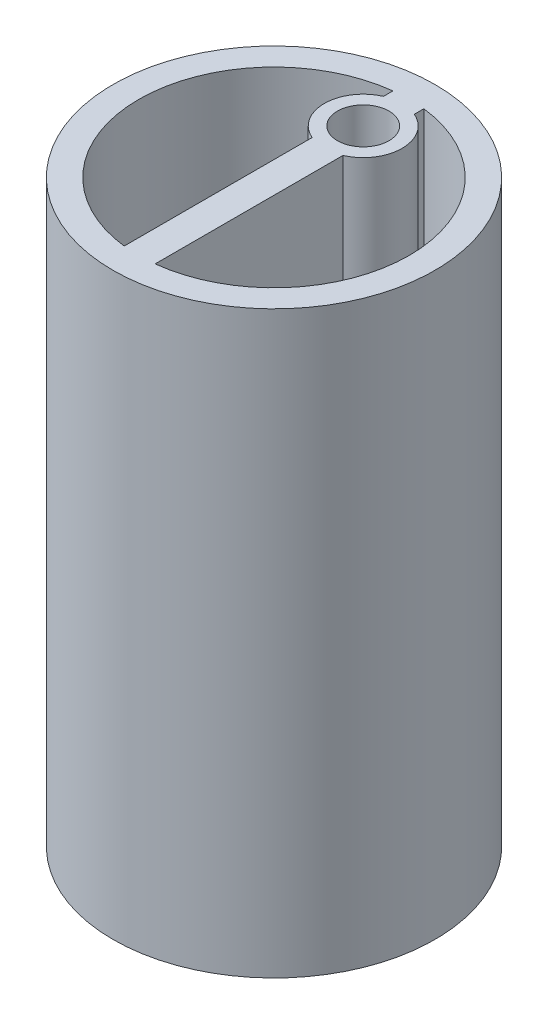
ISO-10303-21;
HEADER;
FILE_DESCRIPTION(('STEP AP214'),'2;1');
FILE_NAME('part.step','',(''),(''),'','','');
FILE_SCHEMA(('AUTOMOTIVE_DESIGN { 1 0 10303 214 1 1 1 1 }'));
ENDSEC;
DATA;
#1=APPLICATION_CONTEXT('core data for automotive mechanical design processes');
#2=APPLICATION_PROTOCOL_DEFINITION('international standard','automotive_design',2000,#1);
#3=PRODUCT_CONTEXT('',#1,'mechanical');
#4=PRODUCT('Part','Part','',(#3));
#5=PRODUCT_RELATED_PRODUCT_CATEGORY('part','',(#4));
#6=PRODUCT_DEFINITION_FORMATION('','',#4);
#7=PRODUCT_DEFINITION_CONTEXT('part definition',#1,'design');
#8=PRODUCT_DEFINITION('design','',#6,#7);
#9=PRODUCT_DEFINITION_SHAPE('','',#8);
#10=(LENGTH_UNIT() NAMED_UNIT(*) SI_UNIT(.MILLI.,.METRE.));
#11=(NAMED_UNIT(*) PLANE_ANGLE_UNIT() SI_UNIT($,.RADIAN.));
#12=(NAMED_UNIT(*) SI_UNIT($,.STERADIAN.) SOLID_ANGLE_UNIT());
#13=UNCERTAINTY_MEASURE_WITH_UNIT(LENGTH_MEASURE(1.E-05),#10,'distance_accuracy_value','');
#14=(GEOMETRIC_REPRESENTATION_CONTEXT(3) GLOBAL_UNCERTAINTY_ASSIGNED_CONTEXT((#13)) GLOBAL_UNIT_ASSIGNED_CONTEXT((#10,
#11,#12)) REPRESENTATION_CONTEXT('',''));
#15=CARTESIAN_POINT('',(0.,0.,0.));
#16=DIRECTION('',(0.,0.,1.));
#17=DIRECTION('',(1.,0.,0.));
#18=AXIS2_PLACEMENT_3D('',#15,#16,#17);
#19=CARTESIAN_POINT('',(-1.2,0.,-11.5945580988698));
#20=DIRECTION('',(-1.,0.,0.));
#21=DIRECTION('',(0.,0.,1.));
#22=AXIS2_PLACEMENT_3D('',#19,#20,#21);
#23=PLANE('',#22);
#24=DIRECTION('',(0.,1.,0.));
#25=VECTOR('',#24,1.);
#26=CARTESIAN_POINT('',(-1.2,0.,-4.15751707339592));
#27=LINE('',#26,#25);
#28=CARTESIAN_POINT('',(-1.2,0.,-4.15751707339592));
#29=VERTEX_POINT('',#28);
#30=CARTESIAN_POINT('',(-1.2,45.,-4.15751707339592));
#31=VERTEX_POINT('',#30);
#32=EDGE_CURVE('E185',#29,#31,#27,.T.);
#33=ORIENTED_EDGE('',*,*,#32,.F.);
#34=DIRECTION('',(0.,0.,1.));
#35=VECTOR('',#34,1.);
#36=CARTESIAN_POINT('',(-1.2,0.,-11.5945580988698));
#37=LINE('',#36,#35);
#38=CARTESIAN_POINT('',(-1.2,0.,10.4312031904282));
#39=VERTEX_POINT('',#38);
#40=EDGE_CURVE('E126',#29,#39,#37,.T.);
#41=ORIENTED_EDGE('',*,*,#40,.T.);
#42=DIRECTION('',(0.,-1.,0.));
#43=VECTOR('',#42,1.);
#44=CARTESIAN_POINT('',(-1.2,45.,10.4312031904282));
#45=LINE('',#44,#43);
#46=CARTESIAN_POINT('',(-1.2,45.,10.4312031904282));
#47=VERTEX_POINT('',#46);
#48=EDGE_CURVE('E160',#39,#47,#45,.F.);
#49=ORIENTED_EDGE('',*,*,#48,.T.);
#50=DIRECTION('',(0.,0.,1.));
#51=VECTOR('',#50,1.);
#52=CARTESIAN_POINT('',(-1.2,45.,-11.5945580988698));
#53=LINE('',#52,#51);
#54=EDGE_CURVE('E195',#31,#47,#53,.T.);
#55=ORIENTED_EDGE('',*,*,#54,.F.);
#56=EDGE_LOOP('',(#33,#41,#49,#55));
#57=FACE_BOUND('',#56,.T.);
#58=ADVANCED_FACE('F39',(#57),#23,.T.);
#59=CARTESIAN_POINT('',(1.2,0.,-11.5945580988698));
#60=DIRECTION('',(1.,0.,0.));
#61=DIRECTION('',(0.,0.,-1.));
#62=AXIS2_PLACEMENT_3D('',#59,#60,#61);
#63=PLANE('',#62);
#64=DIRECTION('',(0.,1.,0.));
#65=VECTOR('',#64,1.);
#66=CARTESIAN_POINT('',(1.2,0.,-9.6993938252536));
#67=LINE('',#66,#65);
#68=CARTESIAN_POINT('',(1.2,0.,-9.6993938252536));
#69=VERTEX_POINT('',#68);
#70=CARTESIAN_POINT('',(1.2,45.,-9.6993938252536));
#71=VERTEX_POINT('',#70);
#72=EDGE_CURVE('E11',#69,#71,#67,.T.);
#73=ORIENTED_EDGE('',*,*,#72,.F.);
#74=DIRECTION('',(0.,0.,-1.));
#75=VECTOR('',#74,1.);
#76=CARTESIAN_POINT('',(1.2,0.,-11.5945580988698));
#77=LINE('',#76,#75);
#78=CARTESIAN_POINT('',(1.2,0.,-10.4312031904282));
#79=VERTEX_POINT('',#78);
#80=EDGE_CURVE('E182',#69,#79,#77,.T.);
#81=ORIENTED_EDGE('',*,*,#80,.T.);
#82=DIRECTION('',(0.,-1.,0.));
#83=VECTOR('',#82,1.);
#84=CARTESIAN_POINT('',(1.2,45.,-10.4312031904282));
#85=LINE('',#84,#83);
#86=CARTESIAN_POINT('',(1.2,45.,-10.4312031904282));
#87=VERTEX_POINT('',#86);
#88=EDGE_CURVE('E150',#79,#87,#85,.F.);
#89=ORIENTED_EDGE('',*,*,#88,.T.);
#90=DIRECTION('',(0.,0.,-1.));
#91=VECTOR('',#90,1.);
#92=CARTESIAN_POINT('',(1.2,45.,-11.5945580988698));
#93=LINE('',#92,#91);
#94=EDGE_CURVE('E127',#71,#87,#93,.T.);
#95=ORIENTED_EDGE('',*,*,#94,.F.);
#96=EDGE_LOOP('',(#73,#81,#89,#95));
#97=FACE_BOUND('',#96,.T.);
#98=ADVANCED_FACE('F228',(#97),#63,.T.);
#99=CARTESIAN_POINT('',(0.,45.,0.));
#100=DIRECTION('',(0.,-1.,0.));
#101=DIRECTION('',(0.,0.,-1.));
#102=AXIS2_PLACEMENT_3D('',#99,#100,#101);
#103=CYLINDRICAL_SURFACE('',#102,10.5);
#104=DIRECTION('',(0.,-1.,0.));
#105=VECTOR('',#104,1.);
#106=CARTESIAN_POINT('',(-1.2,45.,-10.4312031904282));
#107=LINE('',#106,#105);
#108=CARTESIAN_POINT('',(-1.2,45.,-10.4312031904282));
#109=VERTEX_POINT('',#108);
#110=CARTESIAN_POINT('',(-1.2,0.,-10.4312031904282));
#111=VERTEX_POINT('',#110);
#112=EDGE_CURVE('E119',#109,#111,#107,.T.);
#113=ORIENTED_EDGE('',*,*,#112,.F.);
#114=CARTESIAN_POINT('',(0.,45.,0.));
#115=DIRECTION('',(0.,1.,0.));
#116=DIRECTION('',(0.,0.,1.));
#117=AXIS2_PLACEMENT_3D('',#114,#115,#116);
#118=CIRCLE('',#117,10.5);
#119=EDGE_CURVE('E140',#109,#47,#118,.T.);
#120=ORIENTED_EDGE('',*,*,#119,.T.);
#121=ORIENTED_EDGE('',*,*,#48,.F.);
#122=CARTESIAN_POINT('',(0.,0.,0.));
#123=DIRECTION('',(0.,1.,0.));
#124=DIRECTION('',(0.,0.,1.));
#125=AXIS2_PLACEMENT_3D('',#122,#123,#124);
#126=CIRCLE('',#125,10.5);
#127=EDGE_CURVE('E145',#111,#39,#126,.T.);
#128=ORIENTED_EDGE('',*,*,#127,.F.);
#129=EDGE_LOOP('',(#113,#120,#121,#128));
#130=FACE_BOUND('',#129,.T.);
#131=ADVANCED_FACE('F191',(#130),#103,.F.);
#132=CARTESIAN_POINT('',(0.,45.,0.));
#133=DIRECTION('',(0.,1.,0.));
#134=DIRECTION('',(0.,0.,1.));
#135=AXIS2_PLACEMENT_3D('',#132,#133,#134);
#136=PLANE('',#135);
#137=CARTESIAN_POINT('',(0.,45.,-6.92845544932476));
#138=DIRECTION('',(0.,1.,0.));
#139=DIRECTION('',(0.,0.,1.));
#140=AXIS2_PLACEMENT_3D('',#137,#138,#139);
#141=CIRCLE('',#140,2.);
#142=CARTESIAN_POINT('',(0.,45.,-4.92845544932476));
#143=VERTEX_POINT('',#142);
#144=EDGE_CURVE('E205',#143,#143,#141,.T.);
#145=ORIENTED_EDGE('',*,*,#144,.F.);
#146=EDGE_LOOP('',(#145));
#147=FACE_BOUND('',#146,.T.);
#148=CARTESIAN_POINT('',(-1.2,45.,-9.6993938252536));
#149=VERTEX_POINT('',#148);
#150=EDGE_CURVE('E133',#109,#149,#53,.T.);
#151=ORIENTED_EDGE('',*,*,#150,.T.);
#152=CARTESIAN_POINT('',(0.,45.,-6.92845544932476));
#153=DIRECTION('',(0.,1.,0.));
#154=DIRECTION('',(0.,0.,1.));
#155=AXIS2_PLACEMENT_3D('',#152,#153,#154);
#156=CIRCLE('',#155,3.01961909571309);
#157=EDGE_CURVE('E55',#149,#31,#156,.T.);
#158=ORIENTED_EDGE('',*,*,#157,.T.);
#159=ORIENTED_EDGE('',*,*,#54,.T.);
#160=ORIENTED_EDGE('',*,*,#119,.F.);
#161=EDGE_LOOP('',(#151,#158,#159,#160));
#162=FACE_BOUND('',#161,.T.);
#163=CARTESIAN_POINT('',(1.2,45.,-4.15751707339592));
#164=VERTEX_POINT('',#163);
#165=EDGE_CURVE('E63',#164,#71,#156,.T.);
#166=ORIENTED_EDGE('',*,*,#165,.T.);
#167=ORIENTED_EDGE('',*,*,#94,.T.);
#168=CARTESIAN_POINT('',(1.2,45.,10.4312031904282));
#169=VERTEX_POINT('',#168);
#170=EDGE_CURVE('E123',#169,#87,#118,.T.);
#171=ORIENTED_EDGE('',*,*,#170,.F.);
#172=EDGE_CURVE('E115',#169,#164,#93,.T.);
#173=ORIENTED_EDGE('',*,*,#172,.T.);
#174=EDGE_LOOP('',(#166,#167,#171,#173));
#175=FACE_BOUND('',#174,.T.);
#176=CARTESIAN_POINT('',(0.,45.,0.));
#177=DIRECTION('',(0.,1.,0.));
#178=DIRECTION('',(0.,0.,1.));
#179=AXIS2_PLACEMENT_3D('',#176,#177,#178);
#180=CIRCLE('',#179,12.5);
#181=CARTESIAN_POINT('',(0.,45.,-12.5));
#182=VERTEX_POINT('',#181);
#183=EDGE_CURVE('E146',#182,#182,#180,.T.);
#184=ORIENTED_EDGE('',*,*,#183,.T.);
#185=EDGE_LOOP('',(#184));
#186=FACE_BOUND('',#185,.T.);
#187=ADVANCED_FACE('F120',(#147,#162,#175,#186),#136,.T.);
#188=CARTESIAN_POINT('',(0.,0.,0.));
#189=DIRECTION('',(0.,1.,0.));
#190=DIRECTION('',(0.,0.,1.));
#191=AXIS2_PLACEMENT_3D('',#188,#189,#190);
#192=PLANE('',#191);
#193=CARTESIAN_POINT('',(0.,0.,-6.92845544932476));
#194=DIRECTION('',(0.,1.,0.));
#195=DIRECTION('',(0.,0.,1.));
#196=AXIS2_PLACEMENT_3D('',#193,#194,#195);
#197=CIRCLE('',#196,2.);
#198=CARTESIAN_POINT('',(0.,0.,-4.92845544932476));
#199=VERTEX_POINT('',#198);
#200=EDGE_CURVE('E209',#199,#199,#197,.T.);
#201=ORIENTED_EDGE('',*,*,#200,.T.);
#202=EDGE_LOOP('',(#201));
#203=FACE_BOUND('',#202,.T.);
#204=CARTESIAN_POINT('',(0.,0.,-6.92845544932476));
#205=DIRECTION('',(0.,1.,0.));
#206=DIRECTION('',(0.,0.,1.));
#207=AXIS2_PLACEMENT_3D('',#204,#205,#206);
#208=CIRCLE('',#207,3.01961909571309);
#209=CARTESIAN_POINT('',(-1.2,0.,-9.6993938252536));
#210=VERTEX_POINT('',#209);
#211=EDGE_CURVE('E108',#210,#29,#208,.T.);
#212=ORIENTED_EDGE('',*,*,#211,.F.);
#213=EDGE_CURVE('E131',#111,#210,#37,.T.);
#214=ORIENTED_EDGE('',*,*,#213,.F.);
#215=ORIENTED_EDGE('',*,*,#127,.T.);
#216=ORIENTED_EDGE('',*,*,#40,.F.);
#217=EDGE_LOOP('',(#212,#214,#215,#216));
#218=FACE_BOUND('',#217,.T.);
#219=ORIENTED_EDGE('',*,*,#80,.F.);
#220=CARTESIAN_POINT('',(1.2,0.,-4.15751707339592));
#221=VERTEX_POINT('',#220);
#222=EDGE_CURVE('E201',#221,#69,#208,.T.);
#223=ORIENTED_EDGE('',*,*,#222,.F.);
#224=CARTESIAN_POINT('',(1.2,0.,10.4312031904282));
#225=VERTEX_POINT('',#224);
#226=EDGE_CURVE('E117',#225,#221,#77,.T.);
#227=ORIENTED_EDGE('',*,*,#226,.F.);
#228=EDGE_CURVE('E141',#225,#79,#126,.T.);
#229=ORIENTED_EDGE('',*,*,#228,.T.);
#230=EDGE_LOOP('',(#219,#223,#227,#229));
#231=FACE_BOUND('',#230,.T.);
#232=CARTESIAN_POINT('',(0.,0.,0.));
#233=DIRECTION('',(0.,1.,0.));
#234=DIRECTION('',(0.,0.,1.));
#235=AXIS2_PLACEMENT_3D('',#232,#233,#234);
#236=CIRCLE('',#235,12.5);
#237=CARTESIAN_POINT('',(0.,0.,-12.5));
#238=VERTEX_POINT('',#237);
#239=EDGE_CURVE('E139',#238,#238,#236,.T.);
#240=ORIENTED_EDGE('',*,*,#239,.F.);
#241=EDGE_LOOP('',(#240));
#242=FACE_BOUND('',#241,.T.);
#243=ADVANCED_FACE('F178',(#203,#218,#231,#242),#192,.F.);
#244=CARTESIAN_POINT('',(0.,45.,0.));
#245=DIRECTION('',(0.,-1.,0.));
#246=DIRECTION('',(0.,0.,-1.));
#247=AXIS2_PLACEMENT_3D('',#244,#245,#246);
#248=CYLINDRICAL_SURFACE('',#247,12.5);
#249=CARTESIAN_POINT('',(0.,45.,-12.5));
#250=CARTESIAN_POINT('',(0.,44.53125,-12.5));
#251=CARTESIAN_POINT('',(0.,44.0625,-12.5));
#252=CARTESIAN_POINT('',(0.,43.125,-12.5));
#253=CARTESIAN_POINT('',(0.,42.65625,-12.5));
#254=CARTESIAN_POINT('',(0.,41.71875,-12.5));
#255=CARTESIAN_POINT('',(0.,41.25,-12.5));
#256=CARTESIAN_POINT('',(0.,40.3125,-12.5));
#257=CARTESIAN_POINT('',(0.,39.84375,-12.5));
#258=CARTESIAN_POINT('',(0.,38.90625,-12.5));
#259=CARTESIAN_POINT('',(0.,38.4375,-12.5));
#260=CARTESIAN_POINT('',(0.,37.5,-12.5));
#261=CARTESIAN_POINT('',(0.,37.03125,-12.5));
#262=CARTESIAN_POINT('',(0.,36.09375,-12.5));
#263=CARTESIAN_POINT('',(0.,35.625,-12.5));
#264=CARTESIAN_POINT('',(0.,34.6875,-12.5));
#265=CARTESIAN_POINT('',(0.,34.21875,-12.5));
#266=CARTESIAN_POINT('',(0.,33.28125,-12.5));
#267=CARTESIAN_POINT('',(0.,32.8125,-12.5));
#268=CARTESIAN_POINT('',(0.,31.875,-12.5));
#269=CARTESIAN_POINT('',(0.,31.40625,-12.5));
#270=CARTESIAN_POINT('',(0.,30.46875,-12.5));
#271=CARTESIAN_POINT('',(0.,30.,-12.5));
#272=CARTESIAN_POINT('',(0.,29.0625,-12.5));
#273=CARTESIAN_POINT('',(0.,28.59375,-12.5));
#274=CARTESIAN_POINT('',(0.,27.65625,-12.5));
#275=CARTESIAN_POINT('',(0.,27.1875,-12.5));
#276=CARTESIAN_POINT('',(0.,26.25,-12.5));
#277=CARTESIAN_POINT('',(0.,25.78125,-12.5));
#278=CARTESIAN_POINT('',(0.,24.84375,-12.5));
#279=CARTESIAN_POINT('',(0.,24.375,-12.5));
#280=CARTESIAN_POINT('',(0.,23.4375,-12.5));
#281=CARTESIAN_POINT('',(0.,22.96875,-12.5));
#282=CARTESIAN_POINT('',(0.,22.03125,-12.5));
#283=CARTESIAN_POINT('',(0.,21.5625,-12.5));
#284=CARTESIAN_POINT('',(0.,20.625,-12.5));
#285=CARTESIAN_POINT('',(0.,20.15625,-12.5));
#286=CARTESIAN_POINT('',(0.,19.21875,-12.5));
#287=CARTESIAN_POINT('',(0.,18.75,-12.5));
#288=CARTESIAN_POINT('',(0.,17.8125,-12.5));
#289=CARTESIAN_POINT('',(0.,17.34375,-12.5));
#290=CARTESIAN_POINT('',(0.,16.40625,-12.5));
#291=CARTESIAN_POINT('',(0.,15.9375,-12.5));
#292=CARTESIAN_POINT('',(0.,15.,-12.5));
#293=CARTESIAN_POINT('',(0.,14.53125,-12.5));
#294=CARTESIAN_POINT('',(0.,13.59375,-12.5));
#295=CARTESIAN_POINT('',(0.,13.125,-12.5));
#296=CARTESIAN_POINT('',(0.,12.1875,-12.5));
#297=CARTESIAN_POINT('',(0.,11.71875,-12.5));
#298=CARTESIAN_POINT('',(0.,10.78125,-12.5));
#299=CARTESIAN_POINT('',(0.,10.3125,-12.5));
#300=CARTESIAN_POINT('',(0.,9.37499999999999,-12.5));
#301=CARTESIAN_POINT('',(0.,8.90624999999999,-12.5));
#302=CARTESIAN_POINT('',(0.,7.96874999999999,-12.5));
#303=CARTESIAN_POINT('',(0.,7.5,-12.5));
#304=CARTESIAN_POINT('',(0.,6.56249999999999,-12.5));
#305=CARTESIAN_POINT('',(0.,6.09374999999999,-12.5));
#306=CARTESIAN_POINT('',(0.,5.15624999999999,-12.5));
#307=CARTESIAN_POINT('',(0.,4.68749999999999,-12.5));
#308=CARTESIAN_POINT('',(0.,3.74999999999999,-12.5));
#309=CARTESIAN_POINT('',(0.,3.28124999999999,-12.5));
#310=CARTESIAN_POINT('',(0.,2.34374999999999,-12.5));
#311=CARTESIAN_POINT('',(0.,1.87499999999999,-12.5));
#312=CARTESIAN_POINT('',(0.,0.937499999999992,-12.5));
#313=CARTESIAN_POINT('',(0.,0.468749999999993,-12.5));
#314=CARTESIAN_POINT('',(0.,0.,-12.5));
#315=B_SPLINE_CURVE_WITH_KNOTS('',3,(#249,#250,#251,#252,#253,#254,#255,#256,#257,#258,#259,
#260,#261,#262,#263,#264,#265,#266,#267,#268,#269,#270,#271,#272,#273,#274,#275,#276,#277,#278,
#279,#280,#281,#282,#283,#284,#285,#286,#287,#288,#289,#290,#291,#292,#293,#294,#295,#296,#297,
#298,#299,#300,#301,#302,#303,#304,#305,#306,#307,#308,#309,#310,#311,#312,#313,#314),
.UNSPECIFIED.,.F.,.F.,(4,2,2,2,2,2,2,2,2,2,2,2,2,2,2,2,2,2,2,2,2,2,2,2,2,2,2,2,2,2,2,2,4),(0.,
1.40625,2.8125,4.21874999999999,5.625,7.03125,8.43749999999999,9.84375,11.25,12.65625,14.0625,
15.46875,16.875,18.28125,19.6875,21.09375,22.5,23.90625,25.3125,26.71875,28.125,29.53125,
30.9375,32.34375,33.75,35.15625,36.5625,37.96875,39.375,40.78125,42.1875,43.59375,45.),.UNSPECIFIED.);
#316=EDGE_CURVE('BSEAM41',#182,#238,#315,.T.);
#317=ORIENTED_EDGE('',*,*,#183,.F.);
#318=ORIENTED_EDGE('',*,*,#239,.T.);
#319=ORIENTED_EDGE('',*,*,#316,.T.);
#320=ORIENTED_EDGE('',*,*,#316,.F.);
#321=EDGE_LOOP('',(#317,#319,#318,#320));
#322=FACE_BOUND('',#321,.T.);
#323=ADVANCED_FACE('F41',(#322),#248,.T.);
#324=DIRECTION('',(0.,-1.,0.));
#325=VECTOR('',#324,1.);
#326=CARTESIAN_POINT('',(1.2,45.,10.4312031904282));
#327=LINE('',#326,#325);
#328=EDGE_CURVE('E157',#169,#225,#327,.T.);
#329=ORIENTED_EDGE('',*,*,#328,.F.);
#330=ORIENTED_EDGE('',*,*,#170,.T.);
#331=ORIENTED_EDGE('',*,*,#88,.F.);
#332=ORIENTED_EDGE('',*,*,#228,.F.);
#333=EDGE_LOOP('',(#329,#330,#331,#332));
#334=FACE_BOUND('',#333,.T.);
#335=ADVANCED_FACE('F236',(#334),#103,.F.);
#336=DIRECTION('',(0.,1.,0.));
#337=VECTOR('',#336,1.);
#338=CARTESIAN_POINT('',(-1.2,0.,-9.6993938252536));
#339=LINE('',#338,#337);
#340=EDGE_CURVE('E198',#149,#210,#339,.F.);
#341=ORIENTED_EDGE('',*,*,#340,.F.);
#342=ORIENTED_EDGE('',*,*,#150,.F.);
#343=ORIENTED_EDGE('',*,*,#112,.T.);
#344=ORIENTED_EDGE('',*,*,#213,.T.);
#345=EDGE_LOOP('',(#341,#342,#343,#344));
#346=FACE_BOUND('',#345,.T.);
#347=ADVANCED_FACE('F172',(#346),#23,.T.);
#348=DIRECTION('',(0.,1.,0.));
#349=VECTOR('',#348,1.);
#350=CARTESIAN_POINT('',(1.2,0.,-4.15751707339592));
#351=LINE('',#350,#349);
#352=EDGE_CURVE('E48',#164,#221,#351,.F.);
#353=ORIENTED_EDGE('',*,*,#352,.F.);
#354=ORIENTED_EDGE('',*,*,#172,.F.);
#355=ORIENTED_EDGE('',*,*,#328,.T.);
#356=ORIENTED_EDGE('',*,*,#226,.T.);
#357=EDGE_LOOP('',(#353,#354,#355,#356));
#358=FACE_BOUND('',#357,.T.);
#359=ADVANCED_FACE('F113',(#358),#63,.T.);
#360=CARTESIAN_POINT('',(0.,0.,-6.92845544932476));
#361=DIRECTION('',(0.,1.,0.));
#362=DIRECTION('',(0.,0.,1.));
#363=AXIS2_PLACEMENT_3D('',#360,#361,#362);
#364=CYLINDRICAL_SURFACE('',#363,3.01961909571309);
#365=ORIENTED_EDGE('',*,*,#222,.T.);
#366=ORIENTED_EDGE('',*,*,#72,.T.);
#367=ORIENTED_EDGE('',*,*,#165,.F.);
#368=ORIENTED_EDGE('',*,*,#352,.T.);
#369=EDGE_LOOP('',(#365,#366,#367,#368));
#370=FACE_BOUND('',#369,.T.);
#371=ADVANCED_FACE('F103',(#370),#364,.T.);
#372=ORIENTED_EDGE('',*,*,#211,.T.);
#373=ORIENTED_EDGE('',*,*,#32,.T.);
#374=ORIENTED_EDGE('',*,*,#157,.F.);
#375=ORIENTED_EDGE('',*,*,#340,.T.);
#376=EDGE_LOOP('',(#372,#373,#374,#375));
#377=FACE_BOUND('',#376,.T.);
#378=ADVANCED_FACE('F216',(#377),#364,.T.);
#379=CARTESIAN_POINT('',(0.,0.,-6.92845544932476));
#380=DIRECTION('',(0.,1.,0.));
#381=DIRECTION('',(0.,0.,1.));
#382=AXIS2_PLACEMENT_3D('',#379,#380,#381);
#383=CYLINDRICAL_SURFACE('',#382,2.);
#384=CARTESIAN_POINT('',(0.,0.,-4.92845544932476));
#385=CARTESIAN_POINT('',(0.,0.468749999999999,-4.92845544932476));
#386=CARTESIAN_POINT('',(0.,0.9375,-4.92845544932476));
#387=CARTESIAN_POINT('',(0.,1.875,-4.92845544932476));
#388=CARTESIAN_POINT('',(0.,2.34375,-4.92845544932476));
#389=CARTESIAN_POINT('',(0.,3.28125,-4.92845544932476));
#390=CARTESIAN_POINT('',(0.,3.75,-4.92845544932476));
#391=CARTESIAN_POINT('',(0.,4.6875,-4.92845544932476));
#392=CARTESIAN_POINT('',(0.,5.15625,-4.92845544932476));
#393=CARTESIAN_POINT('',(0.,6.09375,-4.92845544932476));
#394=CARTESIAN_POINT('',(0.,6.5625,-4.92845544932476));
#395=CARTESIAN_POINT('',(0.,7.5,-4.92845544932476));
#396=CARTESIAN_POINT('',(0.,7.96875,-4.92845544932476));
#397=CARTESIAN_POINT('',(0.,8.90625,-4.92845544932476));
#398=CARTESIAN_POINT('',(0.,9.375,-4.92845544932476));
#399=CARTESIAN_POINT('',(0.,10.3125,-4.92845544932476));
#400=CARTESIAN_POINT('',(0.,10.78125,-4.92845544932476));
#401=CARTESIAN_POINT('',(0.,11.71875,-4.92845544932476));
#402=CARTESIAN_POINT('',(0.,12.1875,-4.92845544932476));
#403=CARTESIAN_POINT('',(0.,13.125,-4.92845544932476));
#404=CARTESIAN_POINT('',(0.,13.59375,-4.92845544932476));
#405=CARTESIAN_POINT('',(0.,14.53125,-4.92845544932476));
#406=CARTESIAN_POINT('',(0.,15.,-4.92845544932476));
#407=CARTESIAN_POINT('',(0.,15.9375,-4.92845544932476));
#408=CARTESIAN_POINT('',(0.,16.40625,-4.92845544932476));
#409=CARTESIAN_POINT('',(0.,17.34375,-4.92845544932476));
#410=CARTESIAN_POINT('',(0.,17.8125,-4.92845544932476));
#411=CARTESIAN_POINT('',(0.,18.75,-4.92845544932476));
#412=CARTESIAN_POINT('',(0.,19.21875,-4.92845544932476));
#413=CARTESIAN_POINT('',(0.,20.15625,-4.92845544932476));
#414=CARTESIAN_POINT('',(0.,20.625,-4.92845544932476));
#415=CARTESIAN_POINT('',(0.,21.5625,-4.92845544932476));
#416=CARTESIAN_POINT('',(0.,22.03125,-4.92845544932476));
#417=CARTESIAN_POINT('',(0.,22.96875,-4.92845544932476));
#418=CARTESIAN_POINT('',(0.,23.4375,-4.92845544932476));
#419=CARTESIAN_POINT('',(0.,24.375,-4.92845544932476));
#420=CARTESIAN_POINT('',(0.,24.84375,-4.92845544932476));
#421=CARTESIAN_POINT('',(0.,25.78125,-4.92845544932476));
#422=CARTESIAN_POINT('',(0.,26.25,-4.92845544932476));
#423=CARTESIAN_POINT('',(0.,27.1875,-4.92845544932476));
#424=CARTESIAN_POINT('',(0.,27.65625,-4.92845544932476));
#425=CARTESIAN_POINT('',(0.,28.59375,-4.92845544932476));
#426=CARTESIAN_POINT('',(0.,29.0625,-4.92845544932476));
#427=CARTESIAN_POINT('',(0.,30.,-4.92845544932476));
#428=CARTESIAN_POINT('',(0.,30.46875,-4.92845544932476));
#429=CARTESIAN_POINT('',(0.,31.40625,-4.92845544932476));
#430=CARTESIAN_POINT('',(0.,31.875,-4.92845544932476));
#431=CARTESIAN_POINT('',(0.,32.8125,-4.92845544932476));
#432=CARTESIAN_POINT('',(0.,33.28125,-4.92845544932476));
#433=CARTESIAN_POINT('',(0.,34.21875,-4.92845544932476));
#434=CARTESIAN_POINT('',(0.,34.6875,-4.92845544932476));
#435=CARTESIAN_POINT('',(0.,35.625,-4.92845544932476));
#436=CARTESIAN_POINT('',(0.,36.09375,-4.92845544932476));
#437=CARTESIAN_POINT('',(0.,37.03125,-4.92845544932476));
#438=CARTESIAN_POINT('',(0.,37.5,-4.92845544932476));
#439=CARTESIAN_POINT('',(0.,38.4375,-4.92845544932476));
#440=CARTESIAN_POINT('',(0.,38.90625,-4.92845544932476));
#441=CARTESIAN_POINT('',(0.,39.84375,-4.92845544932476));
#442=CARTESIAN_POINT('',(0.,40.3125,-4.92845544932476));
#443=CARTESIAN_POINT('',(0.,41.25,-4.92845544932476));
#444=CARTESIAN_POINT('',(0.,41.71875,-4.92845544932476));
#445=CARTESIAN_POINT('',(0.,42.65625,-4.92845544932476));
#446=CARTESIAN_POINT('',(0.,43.125,-4.92845544932476));
#447=CARTESIAN_POINT('',(0.,44.0625,-4.92845544932476));
#448=CARTESIAN_POINT('',(0.,44.53125,-4.92845544932476));
#449=CARTESIAN_POINT('',(0.,45.,-4.92845544932476));
#450=B_SPLINE_CURVE_WITH_KNOTS('',3,(#384,#385,#386,#387,#388,#389,#390,#391,#392,#393,#394,
#395,#396,#397,#398,#399,#400,#401,#402,#403,#404,#405,#406,#407,#408,#409,#410,#411,#412,#413,
#414,#415,#416,#417,#418,#419,#420,#421,#422,#423,#424,#425,#426,#427,#428,#429,#430,#431,#432,
#433,#434,#435,#436,#437,#438,#439,#440,#441,#442,#443,#444,#445,#446,#447,#448,#449),
.UNSPECIFIED.,.F.,.F.,(4,2,2,2,2,2,2,2,2,2,2,2,2,2,2,2,2,2,2,2,2,2,2,2,2,2,2,2,2,2,2,2,4),(0.,
1.40625,2.8125,4.21875,5.625,7.03125,8.4375,9.84375,11.25,12.65625,14.0625,15.46875,16.875,
18.28125,19.6875,21.09375,22.5,23.90625,25.3125,26.71875,28.125,29.53125,30.9375,32.34375,33.75,
35.15625,36.5625,37.96875,39.375,40.78125,42.1875,43.59375,45.),.UNSPECIFIED.);
#451=EDGE_CURVE('BSEAM218',#199,#143,#450,.T.);
#452=ORIENTED_EDGE('',*,*,#200,.F.);
#453=ORIENTED_EDGE('',*,*,#144,.T.);
#454=ORIENTED_EDGE('',*,*,#451,.T.);
#455=ORIENTED_EDGE('',*,*,#451,.F.);
#456=EDGE_LOOP('',(#452,#454,#453,#455));
#457=FACE_BOUND('',#456,.T.);
#458=ADVANCED_FACE('F218',(#457),#383,.F.);
#459=CLOSED_SHELL('',(#58,#98,#131,#187,#243,#323,#335,#347,#359,#371,#378,#458));
#460=MANIFOLD_SOLID_BREP('B2',#459);
#461=ADVANCED_BREP_SHAPE_REPRESENTATION('',(#18,#460),#14);
#462=SHAPE_DEFINITION_REPRESENTATION(#9,#461);
ENDSEC;
END-ISO-10303-21;
